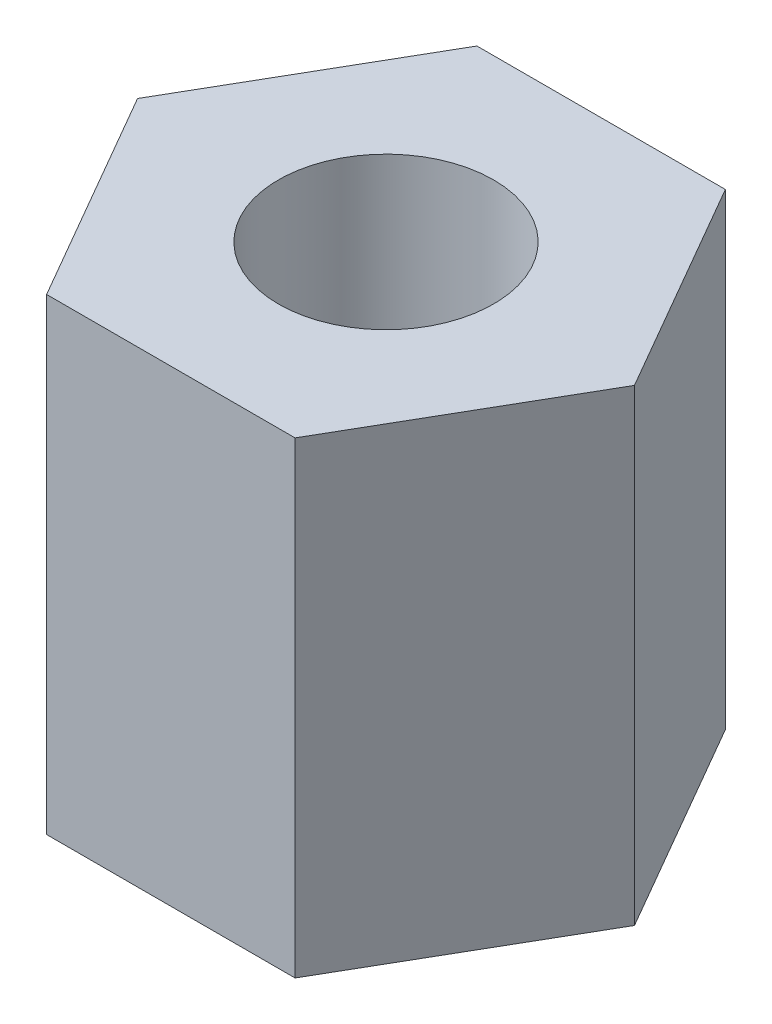
ISO-10303-21;
HEADER;
FILE_DESCRIPTION(('STEP AP214'),'2;1');
FILE_NAME('part.step','',(''),(''),'','','');
FILE_SCHEMA(('AUTOMOTIVE_DESIGN { 1 0 10303 214 1 1 1 1 }'));
ENDSEC;
DATA;
#1=APPLICATION_CONTEXT('core data for automotive mechanical design processes');
#2=APPLICATION_PROTOCOL_DEFINITION('international standard','automotive_design',2000,#1);
#3=PRODUCT_CONTEXT('',#1,'mechanical');
#4=PRODUCT('Part','Part','',(#3));
#5=PRODUCT_RELATED_PRODUCT_CATEGORY('part','',(#4));
#6=PRODUCT_DEFINITION_FORMATION('','',#4);
#7=PRODUCT_DEFINITION_CONTEXT('part definition',#1,'design');
#8=PRODUCT_DEFINITION('design','',#6,#7);
#9=PRODUCT_DEFINITION_SHAPE('','',#8);
#10=(LENGTH_UNIT() NAMED_UNIT(*) SI_UNIT(.MILLI.,.METRE.));
#11=(NAMED_UNIT(*) PLANE_ANGLE_UNIT() SI_UNIT($,.RADIAN.));
#12=(NAMED_UNIT(*) SI_UNIT($,.STERADIAN.) SOLID_ANGLE_UNIT());
#13=UNCERTAINTY_MEASURE_WITH_UNIT(LENGTH_MEASURE(1.E-05),#10,'distance_accuracy_value','');
#14=(GEOMETRIC_REPRESENTATION_CONTEXT(3) GLOBAL_UNCERTAINTY_ASSIGNED_CONTEXT((#13)) GLOBAL_UNIT_ASSIGNED_CONTEXT((#10,
#11,#12)) REPRESENTATION_CONTEXT('',''));
#15=CARTESIAN_POINT('',(0.,0.,0.));
#16=DIRECTION('',(0.,0.,1.));
#17=DIRECTION('',(1.,0.,0.));
#18=AXIS2_PLACEMENT_3D('',#15,#16,#17);
#19=CARTESIAN_POINT('',(0.,5.,0.));
#20=DIRECTION('',(0.,1.,0.));
#21=DIRECTION('',(0.,0.,1.));
#22=AXIS2_PLACEMENT_3D('',#19,#20,#21);
#23=PLANE('',#22);
#24=DIRECTION('',(0.499999999999995,0.,-0.866025403784442));
#25=VECTOR('',#24,1.);
#26=CARTESIAN_POINT('',(2.65581123827233,5.,4.59999999999997));
#27=LINE('',#26,#25);
#28=CARTESIAN_POINT('',(2.65581123827233,5.,4.59999999999997));
#29=VERTEX_POINT('',#28);
#30=CARTESIAN_POINT('',(5.31162247654456,5.,0.));
#31=VERTEX_POINT('',#30);
#32=EDGE_CURVE('E129',#29,#31,#27,.T.);
#33=ORIENTED_EDGE('',*,*,#32,.T.);
#34=DIRECTION('',(-0.500000000000001,0.,-0.866025403784438));
#35=VECTOR('',#34,1.);
#36=CARTESIAN_POINT('',(5.31162247654456,5.,0.));
#37=LINE('',#36,#35);
#38=CARTESIAN_POINT('',(2.65581123827227,5.,-4.60000000000001));
#39=VERTEX_POINT('',#38);
#40=EDGE_CURVE('E87',#31,#39,#37,.T.);
#41=ORIENTED_EDGE('',*,*,#40,.T.);
#42=DIRECTION('',(-1.,0.,0.));
#43=VECTOR('',#42,1.);
#44=CARTESIAN_POINT('',(2.65581123827227,5.,-4.60000000000001));
#45=LINE('',#44,#43);
#46=CARTESIAN_POINT('',(-2.6558112382723,5.,-4.59999999999999));
#47=VERTEX_POINT('',#46);
#48=EDGE_CURVE('E100',#39,#47,#45,.T.);
#49=ORIENTED_EDGE('',*,*,#48,.T.);
#50=DIRECTION('',(-0.499999999999995,0.,0.866025403784441));
#51=VECTOR('',#50,1.);
#52=CARTESIAN_POINT('',(-2.6558112382723,5.,-4.59999999999999));
#53=LINE('',#52,#51);
#54=CARTESIAN_POINT('',(-5.31162247654456,5.,0.));
#55=VERTEX_POINT('',#54);
#56=EDGE_CURVE('E94',#47,#55,#53,.T.);
#57=ORIENTED_EDGE('',*,*,#56,.T.);
#58=DIRECTION('',(0.500000000000007,0.,0.866025403784434));
#59=VECTOR('',#58,1.);
#60=CARTESIAN_POINT('',(-5.31162247654456,5.,0.));
#61=LINE('',#60,#59);
#62=CARTESIAN_POINT('',(-2.65581123827224,5.,4.60000000000003));
#63=VERTEX_POINT('',#62);
#64=EDGE_CURVE('E98',#55,#63,#61,.T.);
#65=ORIENTED_EDGE('',*,*,#64,.T.);
#66=DIRECTION('',(1.,0.,0.));
#67=VECTOR('',#66,1.);
#68=CARTESIAN_POINT('',(-2.65581123827224,5.,4.60000000000003));
#69=LINE('',#68,#67);
#70=EDGE_CURVE('E50',#63,#29,#69,.T.);
#71=ORIENTED_EDGE('',*,*,#70,.T.);
#72=EDGE_LOOP('',(#33,#41,#49,#57,#65,#71));
#73=FACE_BOUND('',#72,.T.);
#74=CARTESIAN_POINT('',(0.,5.,0.));
#75=DIRECTION('',(0.,1.,0.));
#76=DIRECTION('',(0.,0.,1.));
#77=AXIS2_PLACEMENT_3D('',#74,#75,#76);
#78=CIRCLE('',#77,2.3);
#79=CARTESIAN_POINT('',(0.,5.,2.3));
#80=VERTEX_POINT('',#79);
#81=EDGE_CURVE('E122',#80,#80,#78,.T.);
#82=ORIENTED_EDGE('',*,*,#81,.F.);
#83=EDGE_LOOP('',(#82));
#84=FACE_BOUND('',#83,.T.);
#85=ADVANCED_FACE('F33',(#73,#84),#23,.T.);
#86=CARTESIAN_POINT('',(0.,-5.,0.));
#87=DIRECTION('',(0.,1.,0.));
#88=DIRECTION('',(0.,0.,1.));
#89=AXIS2_PLACEMENT_3D('',#86,#87,#88);
#90=PLANE('',#89);
#91=DIRECTION('',(0.499999999999995,0.,-0.866025403784442));
#92=VECTOR('',#91,1.);
#93=CARTESIAN_POINT('',(2.65581123827233,-5.,4.59999999999997));
#94=LINE('',#93,#92);
#95=CARTESIAN_POINT('',(2.65581123827233,-5.,4.59999999999997));
#96=VERTEX_POINT('',#95);
#97=CARTESIAN_POINT('',(5.31162247654456,-5.,0.));
#98=VERTEX_POINT('',#97);
#99=EDGE_CURVE('E118',#96,#98,#94,.T.);
#100=ORIENTED_EDGE('',*,*,#99,.F.);
#101=DIRECTION('',(1.,0.,0.));
#102=VECTOR('',#101,1.);
#103=CARTESIAN_POINT('',(-2.65581123827224,-5.,4.60000000000003));
#104=LINE('',#103,#102);
#105=CARTESIAN_POINT('',(-2.65581123827224,-5.,4.60000000000003));
#106=VERTEX_POINT('',#105);
#107=EDGE_CURVE('E79',#106,#96,#104,.T.);
#108=ORIENTED_EDGE('',*,*,#107,.F.);
#109=DIRECTION('',(0.500000000000007,0.,0.866025403784434));
#110=VECTOR('',#109,1.);
#111=CARTESIAN_POINT('',(-5.31162247654456,-5.,0.));
#112=LINE('',#111,#110);
#113=CARTESIAN_POINT('',(-5.31162247654456,-5.,0.));
#114=VERTEX_POINT('',#113);
#115=EDGE_CURVE('E73',#114,#106,#112,.T.);
#116=ORIENTED_EDGE('',*,*,#115,.F.);
#117=DIRECTION('',(-0.499999999999995,0.,0.866025403784441));
#118=VECTOR('',#117,1.);
#119=CARTESIAN_POINT('',(-2.6558112382723,-5.,-4.59999999999999));
#120=LINE('',#119,#118);
#121=CARTESIAN_POINT('',(-2.6558112382723,-5.,-4.59999999999999));
#122=VERTEX_POINT('',#121);
#123=EDGE_CURVE('E108',#122,#114,#120,.T.);
#124=ORIENTED_EDGE('',*,*,#123,.F.);
#125=DIRECTION('',(-1.,0.,0.));
#126=VECTOR('',#125,1.);
#127=CARTESIAN_POINT('',(2.65581123827227,-5.,-4.60000000000001));
#128=LINE('',#127,#126);
#129=CARTESIAN_POINT('',(2.65581123827227,-5.,-4.60000000000001));
#130=VERTEX_POINT('',#129);
#131=EDGE_CURVE('E124',#130,#122,#128,.T.);
#132=ORIENTED_EDGE('',*,*,#131,.F.);
#133=DIRECTION('',(-0.500000000000001,0.,-0.866025403784438));
#134=VECTOR('',#133,1.);
#135=CARTESIAN_POINT('',(5.31162247654456,-5.,0.));
#136=LINE('',#135,#134);
#137=EDGE_CURVE('E121',#98,#130,#136,.T.);
#138=ORIENTED_EDGE('',*,*,#137,.F.);
#139=EDGE_LOOP('',(#100,#108,#116,#124,#132,#138));
#140=FACE_BOUND('',#139,.T.);
#141=CARTESIAN_POINT('',(0.,-5.,0.));
#142=DIRECTION('',(0.,1.,0.));
#143=DIRECTION('',(0.,0.,1.));
#144=AXIS2_PLACEMENT_3D('',#141,#142,#143);
#145=CIRCLE('',#144,2.3);
#146=CARTESIAN_POINT('',(0.,-5.,2.3));
#147=VERTEX_POINT('',#146);
#148=EDGE_CURVE('E222',#147,#147,#145,.T.);
#149=ORIENTED_EDGE('',*,*,#148,.T.);
#150=EDGE_LOOP('',(#149));
#151=FACE_BOUND('',#150,.T.);
#152=ADVANCED_FACE('F138',(#140,#151),#90,.F.);
#153=CARTESIAN_POINT('',(2.65581123827233,5.,4.59999999999997));
#154=DIRECTION('',(-0.866025403784442,0.,-0.499999999999995));
#155=DIRECTION('',(-0.499999999999995,0.,0.866025403784442));
#156=AXIS2_PLACEMENT_3D('',#153,#154,#155);
#157=PLANE('',#156);
#158=ORIENTED_EDGE('',*,*,#99,.T.);
#159=DIRECTION('',(0.,-1.,0.));
#160=VECTOR('',#159,1.);
#161=CARTESIAN_POINT('',(5.31162247654456,5.,0.));
#162=LINE('',#161,#160);
#163=EDGE_CURVE('E11',#31,#98,#162,.T.);
#164=ORIENTED_EDGE('',*,*,#163,.F.);
#165=ORIENTED_EDGE('',*,*,#32,.F.);
#166=DIRECTION('',(0.,-1.,0.));
#167=VECTOR('',#166,1.);
#168=CARTESIAN_POINT('',(2.65581123827233,5.,4.59999999999997));
#169=LINE('',#168,#167);
#170=EDGE_CURVE('E114',#29,#96,#169,.T.);
#171=ORIENTED_EDGE('',*,*,#170,.T.);
#172=EDGE_LOOP('',(#158,#164,#165,#171));
#173=FACE_BOUND('',#172,.T.);
#174=ADVANCED_FACE('F35',(#173),#157,.F.);
#175=CARTESIAN_POINT('',(5.31162247654456,5.,0.));
#176=DIRECTION('',(-0.866025403784438,0.,0.500000000000001));
#177=DIRECTION('',(0.500000000000001,0.,0.866025403784438));
#178=AXIS2_PLACEMENT_3D('',#175,#176,#177);
#179=PLANE('',#178);
#180=ORIENTED_EDGE('',*,*,#137,.T.);
#181=DIRECTION('',(0.,-1.,0.));
#182=VECTOR('',#181,1.);
#183=CARTESIAN_POINT('',(2.65581123827227,5.,-4.60000000000001));
#184=LINE('',#183,#182);
#185=EDGE_CURVE('E42',#39,#130,#184,.T.);
#186=ORIENTED_EDGE('',*,*,#185,.F.);
#187=ORIENTED_EDGE('',*,*,#40,.F.);
#188=ORIENTED_EDGE('',*,*,#163,.T.);
#189=EDGE_LOOP('',(#180,#186,#187,#188));
#190=FACE_BOUND('',#189,.T.);
#191=ADVANCED_FACE('F163',(#190),#179,.F.);
#192=CARTESIAN_POINT('',(2.65581123827227,5.,-4.60000000000001));
#193=DIRECTION('',(0.,0.,1.));
#194=DIRECTION('',(1.,0.,0.));
#195=AXIS2_PLACEMENT_3D('',#192,#193,#194);
#196=PLANE('',#195);
#197=ORIENTED_EDGE('',*,*,#131,.T.);
#198=DIRECTION('',(0.,-1.,0.));
#199=VECTOR('',#198,1.);
#200=CARTESIAN_POINT('',(-2.6558112382723,5.,-4.59999999999999));
#201=LINE('',#200,#199);
#202=EDGE_CURVE('E109',#47,#122,#201,.T.);
#203=ORIENTED_EDGE('',*,*,#202,.F.);
#204=ORIENTED_EDGE('',*,*,#48,.F.);
#205=ORIENTED_EDGE('',*,*,#185,.T.);
#206=EDGE_LOOP('',(#197,#203,#204,#205));
#207=FACE_BOUND('',#206,.T.);
#208=ADVANCED_FACE('F135',(#207),#196,.F.);
#209=CARTESIAN_POINT('',(-2.6558112382723,5.,-4.59999999999999));
#210=DIRECTION('',(0.866025403784441,0.,0.499999999999995));
#211=DIRECTION('',(0.499999999999995,0.,-0.866025403784441));
#212=AXIS2_PLACEMENT_3D('',#209,#210,#211);
#213=PLANE('',#212);
#214=ORIENTED_EDGE('',*,*,#123,.T.);
#215=DIRECTION('',(0.,-1.,0.));
#216=VECTOR('',#215,1.);
#217=CARTESIAN_POINT('',(-5.31162247654456,5.,0.));
#218=LINE('',#217,#216);
#219=EDGE_CURVE('E105',#55,#114,#218,.T.);
#220=ORIENTED_EDGE('',*,*,#219,.F.);
#221=ORIENTED_EDGE('',*,*,#56,.F.);
#222=ORIENTED_EDGE('',*,*,#202,.T.);
#223=EDGE_LOOP('',(#214,#220,#221,#222));
#224=FACE_BOUND('',#223,.T.);
#225=ADVANCED_FACE('F106',(#224),#213,.F.);
#226=CARTESIAN_POINT('',(-5.31162247654456,5.,0.));
#227=DIRECTION('',(0.866025403784434,0.,-0.500000000000007));
#228=DIRECTION('',(-0.500000000000007,0.,-0.866025403784435));
#229=AXIS2_PLACEMENT_3D('',#226,#227,#228);
#230=PLANE('',#229);
#231=ORIENTED_EDGE('',*,*,#115,.T.);
#232=DIRECTION('',(0.,-1.,0.));
#233=VECTOR('',#232,1.);
#234=CARTESIAN_POINT('',(-2.65581123827224,5.,4.60000000000003));
#235=LINE('',#234,#233);
#236=EDGE_CURVE('E110',#63,#106,#235,.T.);
#237=ORIENTED_EDGE('',*,*,#236,.F.);
#238=ORIENTED_EDGE('',*,*,#64,.F.);
#239=ORIENTED_EDGE('',*,*,#219,.T.);
#240=EDGE_LOOP('',(#231,#237,#238,#239));
#241=FACE_BOUND('',#240,.T.);
#242=ADVANCED_FACE('F112',(#241),#230,.F.);
#243=CARTESIAN_POINT('',(-2.65581123827224,5.,4.60000000000003));
#244=DIRECTION('',(0.,0.,-1.));
#245=DIRECTION('',(-1.,0.,0.));
#246=AXIS2_PLACEMENT_3D('',#243,#244,#245);
#247=PLANE('',#246);
#248=ORIENTED_EDGE('',*,*,#107,.T.);
#249=ORIENTED_EDGE('',*,*,#170,.F.);
#250=ORIENTED_EDGE('',*,*,#70,.F.);
#251=ORIENTED_EDGE('',*,*,#236,.T.);
#252=EDGE_LOOP('',(#248,#249,#250,#251));
#253=FACE_BOUND('',#252,.T.);
#254=ADVANCED_FACE('F143',(#253),#247,.F.);
#255=CARTESIAN_POINT('',(0.,5.,0.));
#256=DIRECTION('',(0.,-1.,0.));
#257=DIRECTION('',(0.,0.,-1.));
#258=AXIS2_PLACEMENT_3D('',#255,#256,#257);
#259=CYLINDRICAL_SURFACE('',#258,2.3);
#260=ORIENTED_EDGE('',*,*,#81,.T.);
#261=EDGE_LOOP('',(#260));
#262=FACE_BOUND('',#261,.T.);
#263=ORIENTED_EDGE('',*,*,#148,.F.);
#264=EDGE_LOOP('',(#263));
#265=FACE_BOUND('',#264,.T.);
#266=ADVANCED_FACE('F145',(#262,#265),#259,.F.);
#267=CLOSED_SHELL('',(#85,#152,#174,#191,#208,#225,#242,#254,#266));
#268=MANIFOLD_SOLID_BREP('B2',#267);
#269=ADVANCED_BREP_SHAPE_REPRESENTATION('',(#18,#268),#14);
#270=SHAPE_DEFINITION_REPRESENTATION(#9,#269);
ENDSEC;
END-ISO-10303-21;
